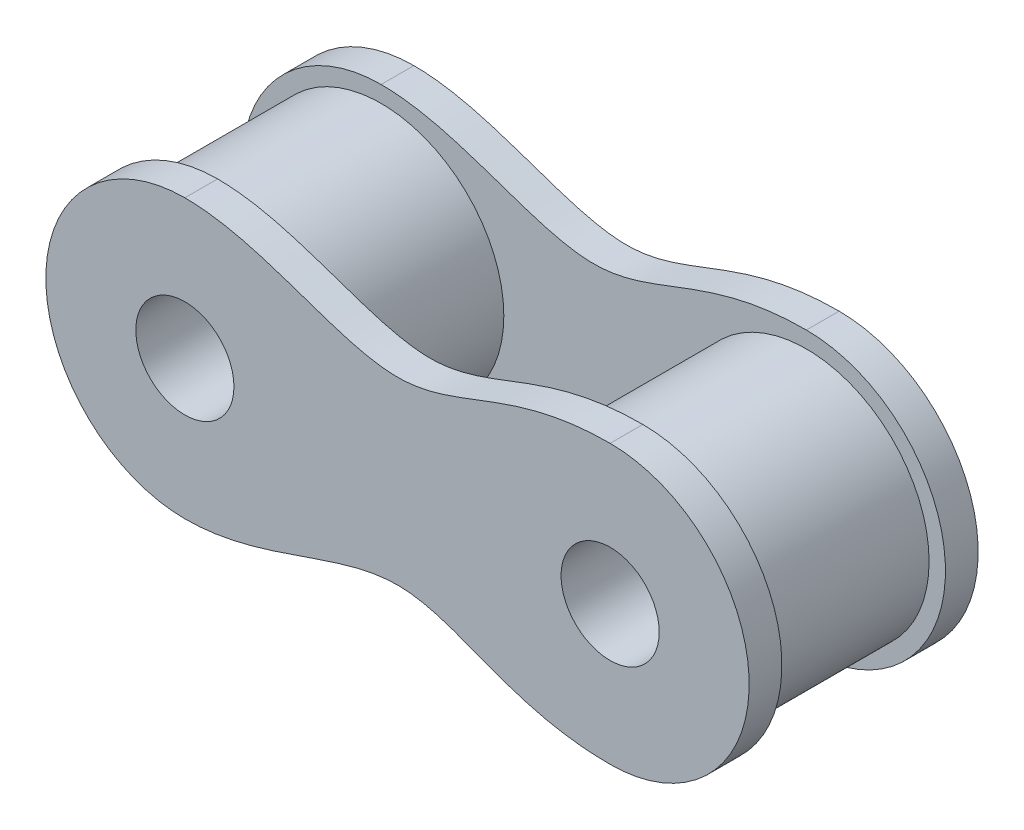
ISO-10303-21;
HEADER;
FILE_DESCRIPTION(('STEP AP214'),'2;1');
FILE_NAME('part.step','',(''),(''),'','','');
FILE_SCHEMA(('AUTOMOTIVE_DESIGN { 1 0 10303 214 1 1 1 1 }'));
ENDSEC;
DATA;
#1=APPLICATION_CONTEXT('core data for automotive mechanical design processes');
#2=APPLICATION_PROTOCOL_DEFINITION('international standard','automotive_design',2000,#1);
#3=PRODUCT_CONTEXT('',#1,'mechanical');
#4=PRODUCT('Part','Part','',(#3));
#5=PRODUCT_RELATED_PRODUCT_CATEGORY('part','',(#4));
#6=PRODUCT_DEFINITION_FORMATION('','',#4);
#7=PRODUCT_DEFINITION_CONTEXT('part definition',#1,'design');
#8=PRODUCT_DEFINITION('design','',#6,#7);
#9=PRODUCT_DEFINITION_SHAPE('','',#8);
#10=(LENGTH_UNIT() NAMED_UNIT(*) SI_UNIT(.MILLI.,.METRE.));
#11=(NAMED_UNIT(*) PLANE_ANGLE_UNIT() SI_UNIT($,.RADIAN.));
#12=(NAMED_UNIT(*) SI_UNIT($,.STERADIAN.) SOLID_ANGLE_UNIT());
#13=UNCERTAINTY_MEASURE_WITH_UNIT(LENGTH_MEASURE(1.E-05),#10,'distance_accuracy_value','');
#14=(GEOMETRIC_REPRESENTATION_CONTEXT(3) GLOBAL_UNCERTAINTY_ASSIGNED_CONTEXT((#13)) GLOBAL_UNIT_ASSIGNED_CONTEXT((#10,
#11,#12)) REPRESENTATION_CONTEXT('',''));
#15=CARTESIAN_POINT('',(0.,0.,0.));
#16=DIRECTION('',(0.,0.,1.));
#17=DIRECTION('',(1.,0.,0.));
#18=AXIS2_PLACEMENT_3D('',#15,#16,#17);
#19=CARTESIAN_POINT('',(6.5,2.75,5.));
#20=DIRECTION('',(0.,0.,1.));
#21=DIRECTION('',(1.,0.,0.));
#22=AXIS2_PLACEMENT_3D('',#19,#20,#21);
#23=PLANE('',#22);
#24=CARTESIAN_POINT('',(13.,4.25,5.));
#25=CARTESIAN_POINT('',(9.8864097179551,4.25,5.));
#26=CARTESIAN_POINT('',(6.86364338574942,1.25,5.));
#27=CARTESIAN_POINT('',(2.38630351054606,4.25,5.));
#28=CARTESIAN_POINT('',(0.,4.25,5.));
#29=B_SPLINE_CURVE_WITH_KNOTS('',3,(#24,#25,#26,#27,#28),.UNSPECIFIED.,.F.,.F.,(4,1,4),(0.,0.5,
1.),.UNSPECIFIED.);
#30=CARTESIAN_POINT('',(13.,4.25,5.));
#31=VERTEX_POINT('',#30);
#32=CARTESIAN_POINT('',(0.,4.25,5.));
#33=VERTEX_POINT('',#32);
#34=EDGE_CURVE('E200',#31,#33,#29,.T.);
#35=ORIENTED_EDGE('',*,*,#34,.F.);
#36=CARTESIAN_POINT('',(13.,0.,5.));
#37=DIRECTION('',(0.,0.,1.));
#38=DIRECTION('',(1.,0.,0.));
#39=AXIS2_PLACEMENT_3D('',#36,#37,#38);
#40=CIRCLE('',#39,4.25);
#41=CARTESIAN_POINT('',(13.,-4.25,5.));
#42=VERTEX_POINT('',#41);
#43=EDGE_CURVE('E75',#42,#31,#40,.T.);
#44=ORIENTED_EDGE('',*,*,#43,.F.);
#45=CARTESIAN_POINT('',(0.,-4.25,5.));
#46=CARTESIAN_POINT('',(2.38630351054606,-4.25,5.));
#47=CARTESIAN_POINT('',(6.86364338574942,-1.25,5.));
#48=CARTESIAN_POINT('',(9.8864097179551,-4.25,5.));
#49=CARTESIAN_POINT('',(13.,-4.25,5.));
#50=B_SPLINE_CURVE_WITH_KNOTS('',3,(#45,#46,#47,#48,#49),.UNSPECIFIED.,.F.,.F.,(4,1,4),(0.,0.5,
1.),.UNSPECIFIED.);
#51=CARTESIAN_POINT('',(0.,-4.25,5.));
#52=VERTEX_POINT('',#51);
#53=EDGE_CURVE('E69',#52,#42,#50,.T.);
#54=ORIENTED_EDGE('',*,*,#53,.F.);
#55=CARTESIAN_POINT('',(0.,0.,5.));
#56=DIRECTION('',(0.,0.,1.));
#57=DIRECTION('',(1.,0.,0.));
#58=AXIS2_PLACEMENT_3D('',#55,#56,#57);
#59=CIRCLE('',#58,4.25);
#60=EDGE_CURVE('E205',#33,#52,#59,.T.);
#61=ORIENTED_EDGE('',*,*,#60,.F.);
#62=EDGE_LOOP('',(#35,#44,#54,#61));
#63=FACE_BOUND('',#62,.T.);
#64=CARTESIAN_POINT('',(0.,0.,5.));
#65=DIRECTION('',(0.,0.,1.));
#66=DIRECTION('',(1.,0.,0.));
#67=AXIS2_PLACEMENT_3D('',#64,#65,#66);
#68=CIRCLE('',#67,3.75);
#69=CARTESIAN_POINT('',(3.75,0.,5.));
#70=VERTEX_POINT('',#69);
#71=EDGE_CURVE('E43',#70,#70,#68,.T.);
#72=ORIENTED_EDGE('',*,*,#71,.T.);
#73=EDGE_LOOP('',(#72));
#74=FACE_BOUND('',#73,.T.);
#75=CARTESIAN_POINT('',(13.,0.,5.));
#76=DIRECTION('',(0.,0.,1.));
#77=DIRECTION('',(1.,0.,0.));
#78=AXIS2_PLACEMENT_3D('',#75,#76,#77);
#79=CIRCLE('',#78,3.75);
#80=CARTESIAN_POINT('',(16.75,0.,5.));
#81=VERTEX_POINT('',#80);
#82=EDGE_CURVE('E11',#81,#81,#79,.F.);
#83=ORIENTED_EDGE('',*,*,#82,.F.);
#84=EDGE_LOOP('',(#83));
#85=FACE_BOUND('',#84,.T.);
#86=ADVANCED_FACE('F34',(#63,#74,#85),#23,.F.);
#87=CARTESIAN_POINT('',(0.,0.,5.));
#88=DIRECTION('',(0.,0.,-1.));
#89=DIRECTION('',(-1.,0.,0.));
#90=AXIS2_PLACEMENT_3D('',#87,#88,#89);
#91=CYLINDRICAL_SURFACE('',#90,3.75);
#92=ORIENTED_EDGE('',*,*,#71,.F.);
#93=EDGE_LOOP('',(#92));
#94=FACE_BOUND('',#93,.T.);
#95=CARTESIAN_POINT('',(0.,0.,0.));
#96=DIRECTION('',(0.,0.,1.));
#97=DIRECTION('',(1.,0.,0.));
#98=AXIS2_PLACEMENT_3D('',#95,#96,#97);
#99=CIRCLE('',#98,3.75);
#100=CARTESIAN_POINT('',(3.75,0.,0.));
#101=VERTEX_POINT('',#100);
#102=EDGE_CURVE('E227',#101,#101,#99,.T.);
#103=ORIENTED_EDGE('',*,*,#102,.T.);
#104=EDGE_LOOP('',(#103));
#105=FACE_BOUND('',#104,.T.);
#106=ADVANCED_FACE('F36',(#94,#105),#91,.T.);
#107=CARTESIAN_POINT('',(0.,0.,5.));
#108=DIRECTION('',(0.,0.,-1.));
#109=DIRECTION('',(-1.,0.,0.));
#110=AXIS2_PLACEMENT_3D('',#107,#108,#109);
#111=CYLINDRICAL_SURFACE('',#110,1.5);
#112=CARTESIAN_POINT('',(0.,0.,6.));
#113=DIRECTION('',(0.,0.,1.));
#114=DIRECTION('',(1.,0.,0.));
#115=AXIS2_PLACEMENT_3D('',#112,#113,#114);
#116=CIRCLE('',#115,1.5);
#117=CARTESIAN_POINT('',(1.5,0.,6.));
#118=VERTEX_POINT('',#117);
#119=EDGE_CURVE('E206',#118,#118,#116,.T.);
#120=ORIENTED_EDGE('',*,*,#119,.T.);
#121=EDGE_LOOP('',(#120));
#122=FACE_BOUND('',#121,.T.);
#123=CARTESIAN_POINT('',(0.,0.,-1.));
#124=DIRECTION('',(0.,0.,1.));
#125=DIRECTION('',(1.,0.,0.));
#126=AXIS2_PLACEMENT_3D('',#123,#124,#125);
#127=CIRCLE('',#126,1.5);
#128=CARTESIAN_POINT('',(1.5,0.,-1.));
#129=VERTEX_POINT('',#128);
#130=EDGE_CURVE('E259',#129,#129,#127,.T.);
#131=ORIENTED_EDGE('',*,*,#130,.F.);
#132=EDGE_LOOP('',(#131));
#133=FACE_BOUND('',#132,.T.);
#134=ADVANCED_FACE('F175',(#122,#133),#111,.F.);
#135=CARTESIAN_POINT('',(6.5,2.75,6.));
#136=DIRECTION('',(0.,0.,1.));
#137=DIRECTION('',(1.,0.,0.));
#138=AXIS2_PLACEMENT_3D('',#135,#136,#137);
#139=PLANE('',#138);
#140=ORIENTED_EDGE('',*,*,#119,.F.);
#141=EDGE_LOOP('',(#140));
#142=FACE_BOUND('',#141,.T.);
#143=CARTESIAN_POINT('',(13.,4.25,6.));
#144=CARTESIAN_POINT('',(9.8864097179551,4.25,6.));
#145=CARTESIAN_POINT('',(6.86364338574942,1.25,6.));
#146=CARTESIAN_POINT('',(2.38630351054606,4.25,6.));
#147=CARTESIAN_POINT('',(0.,4.25,6.));
#148=B_SPLINE_CURVE_WITH_KNOTS('',3,(#143,#144,#145,#146,#147),.UNSPECIFIED.,.F.,.F.,(4,1,4),
(0.,0.5,1.),.UNSPECIFIED.);
#149=CARTESIAN_POINT('',(13.,4.25,6.));
#150=VERTEX_POINT('',#149);
#151=CARTESIAN_POINT('',(0.,4.25,6.));
#152=VERTEX_POINT('',#151);
#153=EDGE_CURVE('E218',#150,#152,#148,.T.);
#154=ORIENTED_EDGE('',*,*,#153,.T.);
#155=CARTESIAN_POINT('',(0.,0.,6.));
#156=DIRECTION('',(0.,0.,1.));
#157=DIRECTION('',(1.,0.,0.));
#158=AXIS2_PLACEMENT_3D('',#155,#156,#157);
#159=CIRCLE('',#158,4.25);
#160=CARTESIAN_POINT('',(0.,-4.25,6.));
#161=VERTEX_POINT('',#160);
#162=EDGE_CURVE('E83',#152,#161,#159,.T.);
#163=ORIENTED_EDGE('',*,*,#162,.T.);
#164=CARTESIAN_POINT('',(0.,-4.25,6.));
#165=CARTESIAN_POINT('',(2.38630351054606,-4.25,6.));
#166=CARTESIAN_POINT('',(6.86364338574942,-1.25,6.));
#167=CARTESIAN_POINT('',(9.8864097179551,-4.25,6.));
#168=CARTESIAN_POINT('',(13.,-4.25,6.));
#169=B_SPLINE_CURVE_WITH_KNOTS('',3,(#164,#165,#166,#167,#168),.UNSPECIFIED.,.F.,.F.,(4,1,4),
(0.,0.5,1.),.UNSPECIFIED.);
#170=CARTESIAN_POINT('',(13.,-4.25,6.));
#171=VERTEX_POINT('',#170);
#172=EDGE_CURVE('E188',#161,#171,#169,.T.);
#173=ORIENTED_EDGE('',*,*,#172,.T.);
#174=CARTESIAN_POINT('',(13.,0.,6.));
#175=DIRECTION('',(0.,0.,1.));
#176=DIRECTION('',(1.,0.,0.));
#177=AXIS2_PLACEMENT_3D('',#174,#175,#176);
#178=CIRCLE('',#177,4.25);
#179=EDGE_CURVE('E51',#171,#150,#178,.T.);
#180=ORIENTED_EDGE('',*,*,#179,.T.);
#181=EDGE_LOOP('',(#154,#163,#173,#180));
#182=FACE_BOUND('',#181,.T.);
#183=CARTESIAN_POINT('',(13.,0.,6.));
#184=DIRECTION('',(0.,0.,1.));
#185=DIRECTION('',(1.,0.,0.));
#186=AXIS2_PLACEMENT_3D('',#183,#184,#185);
#187=CIRCLE('',#186,1.5);
#188=CARTESIAN_POINT('',(14.5,0.,6.));
#189=VERTEX_POINT('',#188);
#190=EDGE_CURVE('E229',#189,#189,#187,.T.);
#191=ORIENTED_EDGE('',*,*,#190,.F.);
#192=EDGE_LOOP('',(#191));
#193=FACE_BOUND('',#192,.T.);
#194=ADVANCED_FACE('F171',(#142,#182,#193),#139,.T.);
#195=DIRECTION('',(0.,0.,-1.));
#196=VECTOR('',#195,1.);
#197=SURFACE_OF_LINEAR_EXTRUSION('',#148,#196);
#198=ORIENTED_EDGE('',*,*,#34,.T.);
#199=DIRECTION('',(0.,0.,-1.));
#200=VECTOR('',#199,1.);
#201=CARTESIAN_POINT('',(0.,4.25,6.));
#202=LINE('',#201,#200);
#203=EDGE_CURVE('E224',#152,#33,#202,.T.);
#204=ORIENTED_EDGE('',*,*,#203,.F.);
#205=ORIENTED_EDGE('',*,*,#153,.F.);
#206=DIRECTION('',(0.,0.,-1.));
#207=VECTOR('',#206,1.);
#208=CARTESIAN_POINT('',(13.,4.25,6.));
#209=LINE('',#208,#207);
#210=EDGE_CURVE('E199',#150,#31,#209,.T.);
#211=ORIENTED_EDGE('',*,*,#210,.T.);
#212=EDGE_LOOP('',(#198,#204,#205,#211));
#213=FACE_BOUND('',#212,.T.);
#214=ADVANCED_FACE('F174',(#213),#197,.F.);
#215=CARTESIAN_POINT('',(0.,0.,6.));
#216=DIRECTION('',(0.,0.,-1.));
#217=DIRECTION('',(-1.,0.,0.));
#218=AXIS2_PLACEMENT_3D('',#215,#216,#217);
#219=CYLINDRICAL_SURFACE('',#218,4.25);
#220=ORIENTED_EDGE('',*,*,#60,.T.);
#221=DIRECTION('',(0.,0.,-1.));
#222=VECTOR('',#221,1.);
#223=CARTESIAN_POINT('',(0.,-4.25,6.));
#224=LINE('',#223,#222);
#225=EDGE_CURVE('E222',#161,#52,#224,.T.);
#226=ORIENTED_EDGE('',*,*,#225,.F.);
#227=ORIENTED_EDGE('',*,*,#162,.F.);
#228=ORIENTED_EDGE('',*,*,#203,.T.);
#229=EDGE_LOOP('',(#220,#226,#227,#228));
#230=FACE_BOUND('',#229,.T.);
#231=ADVANCED_FACE('F186',(#230),#219,.T.);
#232=DIRECTION('',(0.,0.,-1.));
#233=VECTOR('',#232,1.);
#234=SURFACE_OF_LINEAR_EXTRUSION('',#169,#233);
#235=ORIENTED_EDGE('',*,*,#53,.T.);
#236=DIRECTION('',(0.,0.,-1.));
#237=VECTOR('',#236,1.);
#238=CARTESIAN_POINT('',(13.,-4.25,6.));
#239=LINE('',#238,#237);
#240=EDGE_CURVE('E220',#171,#42,#239,.T.);
#241=ORIENTED_EDGE('',*,*,#240,.F.);
#242=ORIENTED_EDGE('',*,*,#172,.F.);
#243=ORIENTED_EDGE('',*,*,#225,.T.);
#244=EDGE_LOOP('',(#235,#241,#242,#243));
#245=FACE_BOUND('',#244,.T.);
#246=ADVANCED_FACE('F182',(#245),#234,.F.);
#247=CARTESIAN_POINT('',(13.,0.,6.));
#248=DIRECTION('',(0.,0.,-1.));
#249=DIRECTION('',(-1.,0.,0.));
#250=AXIS2_PLACEMENT_3D('',#247,#248,#249);
#251=CYLINDRICAL_SURFACE('',#250,4.25);
#252=ORIENTED_EDGE('',*,*,#43,.T.);
#253=ORIENTED_EDGE('',*,*,#210,.F.);
#254=ORIENTED_EDGE('',*,*,#179,.F.);
#255=ORIENTED_EDGE('',*,*,#240,.T.);
#256=EDGE_LOOP('',(#252,#253,#254,#255));
#257=FACE_BOUND('',#256,.T.);
#258=ADVANCED_FACE('F169',(#257),#251,.T.);
#259=CARTESIAN_POINT('',(13.,0.,6.));
#260=DIRECTION('',(0.,0.,-1.));
#261=DIRECTION('',(-1.,0.,0.));
#262=AXIS2_PLACEMENT_3D('',#259,#260,#261);
#263=CYLINDRICAL_SURFACE('',#262,1.5);
#264=ORIENTED_EDGE('',*,*,#190,.T.);
#265=EDGE_LOOP('',(#264));
#266=FACE_BOUND('',#265,.T.);
#267=CARTESIAN_POINT('',(13.,0.,-1.));
#268=DIRECTION('',(0.,0.,1.));
#269=DIRECTION('',(1.,0.,0.));
#270=AXIS2_PLACEMENT_3D('',#267,#268,#269);
#271=CIRCLE('',#270,1.5);
#272=CARTESIAN_POINT('',(14.5,0.,-1.));
#273=VERTEX_POINT('',#272);
#274=EDGE_CURVE('E261',#273,#273,#271,.T.);
#275=ORIENTED_EDGE('',*,*,#274,.F.);
#276=EDGE_LOOP('',(#275));
#277=FACE_BOUND('',#276,.T.);
#278=ADVANCED_FACE('F165',(#266,#277),#263,.F.);
#279=CARTESIAN_POINT('',(13.,0.,5.));
#280=DIRECTION('',(0.,0.,-1.));
#281=DIRECTION('',(-1.,0.,0.));
#282=AXIS2_PLACEMENT_3D('',#279,#280,#281);
#283=CYLINDRICAL_SURFACE('',#282,3.75);
#284=ORIENTED_EDGE('',*,*,#82,.T.);
#285=EDGE_LOOP('',(#284));
#286=FACE_BOUND('',#285,.T.);
#287=CARTESIAN_POINT('',(13.,0.,0.));
#288=DIRECTION('',(0.,0.,1.));
#289=DIRECTION('',(1.,0.,0.));
#290=AXIS2_PLACEMENT_3D('',#287,#288,#289);
#291=CIRCLE('',#290,3.75);
#292=CARTESIAN_POINT('',(16.75,0.,0.));
#293=VERTEX_POINT('',#292);
#294=EDGE_CURVE('E121',#293,#293,#291,.T.);
#295=ORIENTED_EDGE('',*,*,#294,.T.);
#296=EDGE_LOOP('',(#295));
#297=FACE_BOUND('',#296,.T.);
#298=ADVANCED_FACE('F162',(#286,#297),#283,.T.);
#299=CARTESIAN_POINT('',(13.,4.25,-1.));
#300=CARTESIAN_POINT('',(9.8864097179551,4.25,-1.));
#301=CARTESIAN_POINT('',(6.86364338574942,1.25,-1.));
#302=CARTESIAN_POINT('',(2.38630351054606,4.25,-1.));
#303=CARTESIAN_POINT('',(0.,4.25,-1.));
#304=B_SPLINE_CURVE_WITH_KNOTS('',3,(#299,#300,#301,#302,#303),.UNSPECIFIED.,.F.,.F.,(4,1,4),
(0.,0.5,1.),.UNSPECIFIED.);
#305=DIRECTION('',(0.,0.,1.));
#306=VECTOR('',#305,1.);
#307=SURFACE_OF_LINEAR_EXTRUSION('',#304,#306);
#308=CARTESIAN_POINT('',(13.,4.25,0.));
#309=CARTESIAN_POINT('',(9.8864097179551,4.25,0.));
#310=CARTESIAN_POINT('',(6.86364338574942,1.25,0.));
#311=CARTESIAN_POINT('',(2.38630351054606,4.25,0.));
#312=CARTESIAN_POINT('',(0.,4.25,0.));
#313=B_SPLINE_CURVE_WITH_KNOTS('',3,(#308,#309,#310,#311,#312),.UNSPECIFIED.,.F.,.F.,(4,1,4),
(0.,0.5,1.),.UNSPECIFIED.);
#314=CARTESIAN_POINT('',(13.,4.25,0.));
#315=VERTEX_POINT('',#314);
#316=CARTESIAN_POINT('',(0.,4.25,0.));
#317=VERTEX_POINT('',#316);
#318=EDGE_CURVE('E116',#315,#317,#313,.T.);
#319=ORIENTED_EDGE('',*,*,#318,.F.);
#320=DIRECTION('',(0.,0.,1.));
#321=VECTOR('',#320,1.);
#322=CARTESIAN_POINT('',(13.,4.25,-1.));
#323=LINE('',#322,#321);
#324=CARTESIAN_POINT('',(13.,4.25,-1.));
#325=VERTEX_POINT('',#324);
#326=EDGE_CURVE('E110',#325,#315,#323,.T.);
#327=ORIENTED_EDGE('',*,*,#326,.F.);
#328=CARTESIAN_POINT('',(0.,4.25,-1.));
#329=VERTEX_POINT('',#328);
#330=EDGE_CURVE('E113',#325,#329,#304,.T.);
#331=ORIENTED_EDGE('',*,*,#330,.T.);
#332=DIRECTION('',(0.,0.,1.));
#333=VECTOR('',#332,1.);
#334=CARTESIAN_POINT('',(0.,4.25,-1.));
#335=LINE('',#334,#333);
#336=EDGE_CURVE('E281',#329,#317,#335,.T.);
#337=ORIENTED_EDGE('',*,*,#336,.T.);
#338=EDGE_LOOP('',(#319,#327,#331,#337));
#339=FACE_BOUND('',#338,.T.);
#340=ADVANCED_FACE('F112',(#339),#307,.T.);
#341=CARTESIAN_POINT('',(13.,0.,-1.));
#342=DIRECTION('',(0.,0.,1.));
#343=DIRECTION('',(1.,0.,0.));
#344=AXIS2_PLACEMENT_3D('',#341,#342,#343);
#345=CYLINDRICAL_SURFACE('',#344,4.25);
#346=CARTESIAN_POINT('',(13.,0.,0.));
#347=DIRECTION('',(0.,0.,1.));
#348=DIRECTION('',(1.,0.,0.));
#349=AXIS2_PLACEMENT_3D('',#346,#347,#348);
#350=CIRCLE('',#349,4.25);
#351=CARTESIAN_POINT('',(13.,-4.25,0.));
#352=VERTEX_POINT('',#351);
#353=EDGE_CURVE('E262',#352,#315,#350,.T.);
#354=ORIENTED_EDGE('',*,*,#353,.F.);
#355=DIRECTION('',(0.,0.,1.));
#356=VECTOR('',#355,1.);
#357=CARTESIAN_POINT('',(13.,-4.25,-1.));
#358=LINE('',#357,#356);
#359=CARTESIAN_POINT('',(13.,-4.25,-1.));
#360=VERTEX_POINT('',#359);
#361=EDGE_CURVE('E122',#360,#352,#358,.T.);
#362=ORIENTED_EDGE('',*,*,#361,.F.);
#363=CARTESIAN_POINT('',(13.,0.,-1.));
#364=DIRECTION('',(0.,0.,1.));
#365=DIRECTION('',(1.,0.,0.));
#366=AXIS2_PLACEMENT_3D('',#363,#364,#365);
#367=CIRCLE('',#366,4.25);
#368=EDGE_CURVE('E128',#360,#325,#367,.T.);
#369=ORIENTED_EDGE('',*,*,#368,.T.);
#370=ORIENTED_EDGE('',*,*,#326,.T.);
#371=EDGE_LOOP('',(#354,#362,#369,#370));
#372=FACE_BOUND('',#371,.T.);
#373=ADVANCED_FACE('F134',(#372),#345,.T.);
#374=CARTESIAN_POINT('',(0.,-4.25,-1.));
#375=CARTESIAN_POINT('',(2.38630351054606,-4.25,-1.));
#376=CARTESIAN_POINT('',(6.86364338574942,-1.25,-1.));
#377=CARTESIAN_POINT('',(9.8864097179551,-4.25,-1.));
#378=CARTESIAN_POINT('',(13.,-4.25,-1.));
#379=B_SPLINE_CURVE_WITH_KNOTS('',3,(#374,#375,#376,#377,#378),.UNSPECIFIED.,.F.,.F.,(4,1,4),
(0.,0.5,1.),.UNSPECIFIED.);
#380=DIRECTION('',(0.,0.,1.));
#381=VECTOR('',#380,1.);
#382=SURFACE_OF_LINEAR_EXTRUSION('',#379,#381);
#383=CARTESIAN_POINT('',(0.,-4.25,0.));
#384=CARTESIAN_POINT('',(2.38630351054606,-4.25,0.));
#385=CARTESIAN_POINT('',(6.86364338574942,-1.25,0.));
#386=CARTESIAN_POINT('',(9.8864097179551,-4.25,0.));
#387=CARTESIAN_POINT('',(13.,-4.25,0.));
#388=B_SPLINE_CURVE_WITH_KNOTS('',3,(#383,#384,#385,#386,#387),.UNSPECIFIED.,.F.,.F.,(4,1,4),
(0.,0.5,1.),.UNSPECIFIED.);
#389=CARTESIAN_POINT('',(0.,-4.25,0.));
#390=VERTEX_POINT('',#389);
#391=EDGE_CURVE('E286',#390,#352,#388,.T.);
#392=ORIENTED_EDGE('',*,*,#391,.F.);
#393=DIRECTION('',(0.,0.,1.));
#394=VECTOR('',#393,1.);
#395=CARTESIAN_POINT('',(0.,-4.25,-1.));
#396=LINE('',#395,#394);
#397=CARTESIAN_POINT('',(0.,-4.25,-1.));
#398=VERTEX_POINT('',#397);
#399=EDGE_CURVE('E282',#398,#390,#396,.T.);
#400=ORIENTED_EDGE('',*,*,#399,.F.);
#401=EDGE_CURVE('E135',#398,#360,#379,.T.);
#402=ORIENTED_EDGE('',*,*,#401,.T.);
#403=ORIENTED_EDGE('',*,*,#361,.T.);
#404=EDGE_LOOP('',(#392,#400,#402,#403));
#405=FACE_BOUND('',#404,.T.);
#406=ADVANCED_FACE('F151',(#405),#382,.T.);
#407=CARTESIAN_POINT('',(0.,0.,-1.));
#408=DIRECTION('',(0.,0.,1.));
#409=DIRECTION('',(1.,0.,0.));
#410=AXIS2_PLACEMENT_3D('',#407,#408,#409);
#411=CYLINDRICAL_SURFACE('',#410,4.25);
#412=CARTESIAN_POINT('',(0.,0.,0.));
#413=DIRECTION('',(0.,0.,1.));
#414=DIRECTION('',(1.,0.,0.));
#415=AXIS2_PLACEMENT_3D('',#412,#413,#414);
#416=CIRCLE('',#415,4.25);
#417=EDGE_CURVE('E132',#317,#390,#416,.T.);
#418=ORIENTED_EDGE('',*,*,#417,.F.);
#419=ORIENTED_EDGE('',*,*,#336,.F.);
#420=CARTESIAN_POINT('',(0.,0.,-1.));
#421=DIRECTION('',(0.,0.,1.));
#422=DIRECTION('',(1.,0.,0.));
#423=AXIS2_PLACEMENT_3D('',#420,#421,#422);
#424=CIRCLE('',#423,4.25);
#425=EDGE_CURVE('E131',#329,#398,#424,.T.);
#426=ORIENTED_EDGE('',*,*,#425,.T.);
#427=ORIENTED_EDGE('',*,*,#399,.T.);
#428=EDGE_LOOP('',(#418,#419,#426,#427));
#429=FACE_BOUND('',#428,.T.);
#430=ADVANCED_FACE('F155',(#429),#411,.T.);
#431=CARTESIAN_POINT('',(6.5,2.75,-1.));
#432=DIRECTION('',(0.,0.,-1.));
#433=DIRECTION('',(1.,0.,0.));
#434=AXIS2_PLACEMENT_3D('',#431,#432,#433);
#435=PLANE('',#434);
#436=ORIENTED_EDGE('',*,*,#274,.T.);
#437=EDGE_LOOP('',(#436));
#438=FACE_BOUND('',#437,.T.);
#439=ORIENTED_EDGE('',*,*,#130,.T.);
#440=EDGE_LOOP('',(#439));
#441=FACE_BOUND('',#440,.T.);
#442=ORIENTED_EDGE('',*,*,#330,.F.);
#443=ORIENTED_EDGE('',*,*,#368,.F.);
#444=ORIENTED_EDGE('',*,*,#401,.F.);
#445=ORIENTED_EDGE('',*,*,#425,.F.);
#446=EDGE_LOOP('',(#442,#443,#444,#445));
#447=FACE_BOUND('',#446,.T.);
#448=ADVANCED_FACE('F126',(#438,#441,#447),#435,.T.);
#449=CARTESIAN_POINT('',(6.5,2.75,0.));
#450=DIRECTION('',(0.,0.,-1.));
#451=DIRECTION('',(1.,0.,0.));
#452=AXIS2_PLACEMENT_3D('',#449,#450,#451);
#453=PLANE('',#452);
#454=ORIENTED_EDGE('',*,*,#102,.F.);
#455=EDGE_LOOP('',(#454));
#456=FACE_BOUND('',#455,.T.);
#457=ORIENTED_EDGE('',*,*,#294,.F.);
#458=EDGE_LOOP('',(#457));
#459=FACE_BOUND('',#458,.T.);
#460=ORIENTED_EDGE('',*,*,#318,.T.);
#461=ORIENTED_EDGE('',*,*,#417,.T.);
#462=ORIENTED_EDGE('',*,*,#391,.T.);
#463=ORIENTED_EDGE('',*,*,#353,.T.);
#464=EDGE_LOOP('',(#460,#461,#462,#463));
#465=FACE_BOUND('',#464,.T.);
#466=ADVANCED_FACE('F269',(#456,#459,#465),#453,.F.);
#467=CLOSED_SHELL('',(#86,#106,#134,#194,#214,#231,#246,#258,#278,#298,#340,#373,#406,#430,#448,#466));
#468=MANIFOLD_SOLID_BREP('B2',#467);
#469=ADVANCED_BREP_SHAPE_REPRESENTATION('',(#18,#468),#14);
#470=SHAPE_DEFINITION_REPRESENTATION(#9,#469);
ENDSEC;
END-ISO-10303-21;
